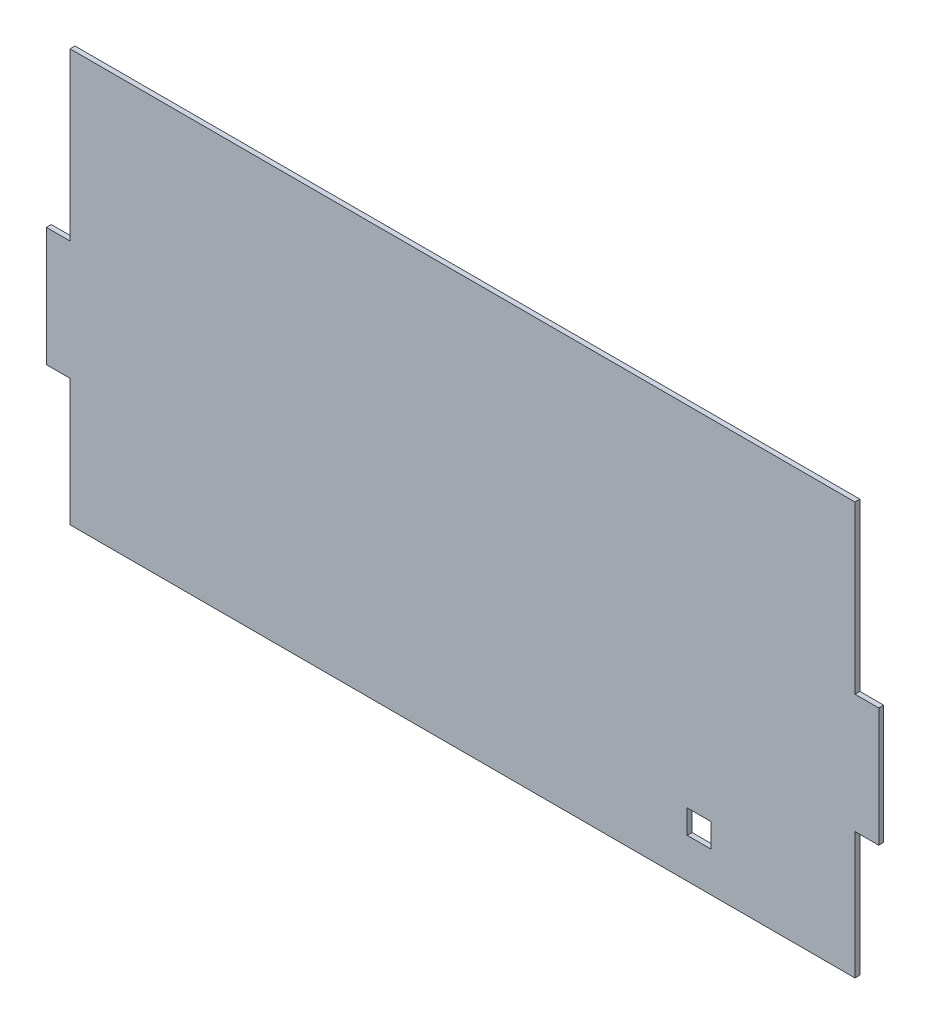
ISO-10303-21;
HEADER;
FILE_DESCRIPTION(('STEP AP214'),'2;1');
FILE_NAME('part.step','',(''),(''),'','','');
FILE_SCHEMA(('AUTOMOTIVE_DESIGN { 1 0 10303 214 1 1 1 1 }'));
ENDSEC;
DATA;
#1=APPLICATION_CONTEXT('core data for automotive mechanical design processes');
#2=APPLICATION_PROTOCOL_DEFINITION('international standard','automotive_design',2000,#1);
#3=PRODUCT_CONTEXT('',#1,'mechanical');
#4=PRODUCT('Part','Part','',(#3));
#5=PRODUCT_RELATED_PRODUCT_CATEGORY('part','',(#4));
#6=PRODUCT_DEFINITION_FORMATION('','',#4);
#7=PRODUCT_DEFINITION_CONTEXT('part definition',#1,'design');
#8=PRODUCT_DEFINITION('design','',#6,#7);
#9=PRODUCT_DEFINITION_SHAPE('','',#8);
#10=(LENGTH_UNIT() NAMED_UNIT(*) SI_UNIT(.MILLI.,.METRE.));
#11=(NAMED_UNIT(*) PLANE_ANGLE_UNIT() SI_UNIT($,.RADIAN.));
#12=(NAMED_UNIT(*) SI_UNIT($,.STERADIAN.) SOLID_ANGLE_UNIT());
#13=UNCERTAINTY_MEASURE_WITH_UNIT(LENGTH_MEASURE(1.E-05),#10,'distance_accuracy_value','');
#14=(GEOMETRIC_REPRESENTATION_CONTEXT(3) GLOBAL_UNCERTAINTY_ASSIGNED_CONTEXT((#13)) GLOBAL_UNIT_ASSIGNED_CONTEXT((#10,
#11,#12)) REPRESENTATION_CONTEXT('',''));
#15=CARTESIAN_POINT('',(0.,0.,0.));
#16=DIRECTION('',(0.,0.,1.));
#17=DIRECTION('',(1.,0.,0.));
#18=AXIS2_PLACEMENT_3D('',#15,#16,#17);
#19=CARTESIAN_POINT('',(0.,0.,3.));
#20=DIRECTION('',(0.,0.,-1.));
#21=DIRECTION('',(-1.,0.,0.));
#22=AXIS2_PLACEMENT_3D('',#19,#20,#21);
#23=PLANE('',#22);
#24=DIRECTION('',(0.,1.,0.));
#25=VECTOR('',#24,1.);
#26=CARTESIAN_POINT('',(987.723312498486,1081.39766001597,3.));
#27=LINE('',#26,#25);
#28=CARTESIAN_POINT('',(987.723312498486,1081.39766001597,3.));
#29=VERTEX_POINT('',#28);
#30=CARTESIAN_POINT('',(987.723312498486,1158.83589741721,3.));
#31=VERTEX_POINT('',#30);
#32=EDGE_CURVE('E182',#29,#31,#27,.T.);
#33=ORIENTED_EDGE('',*,*,#32,.T.);
#34=DIRECTION('',(1.,0.,0.));
#35=VECTOR('',#34,1.);
#36=CARTESIAN_POINT('',(987.723312498486,1158.83589741721,3.));
#37=LINE('',#36,#35);
#38=CARTESIAN_POINT('',(1002.2431904385,1158.83589741721,3.));
#39=VERTEX_POINT('',#38);
#40=EDGE_CURVE('E185',#31,#39,#37,.T.);
#41=ORIENTED_EDGE('',*,*,#40,.T.);
#42=DIRECTION('',(0.,1.,0.));
#43=VECTOR('',#42,1.);
#44=CARTESIAN_POINT('',(1002.2431904385,1158.83589741721,3.));
#45=LINE('',#44,#43);
#46=CARTESIAN_POINT('',(1002.2431904385,1231.43862195372,3.));
#47=VERTEX_POINT('',#46);
#48=EDGE_CURVE('E188',#39,#47,#45,.T.);
#49=ORIENTED_EDGE('',*,*,#48,.T.);
#50=DIRECTION('',(-1.,0.,0.));
#51=VECTOR('',#50,1.);
#52=CARTESIAN_POINT('',(1002.2431904385,1231.43862195372,3.));
#53=LINE('',#52,#51);
#54=CARTESIAN_POINT('',(987.723312498486,1231.43862195372,3.));
#55=VERTEX_POINT('',#54);
#56=EDGE_CURVE('E190',#47,#55,#53,.T.);
#57=ORIENTED_EDGE('',*,*,#56,.T.);
#58=DIRECTION('',(0.,1.,0.));
#59=VECTOR('',#58,1.);
#60=CARTESIAN_POINT('',(987.723312498486,1231.43862195372,3.));
#61=LINE('',#60,#59);
#62=CARTESIAN_POINT('',(987.723312498486,1333.07443269733,3.));
#63=VERTEX_POINT('',#62);
#64=EDGE_CURVE('E192',#55,#63,#61,.T.);
#65=ORIENTED_EDGE('',*,*,#64,.T.);
#66=DIRECTION('',(-1.,0.,0.));
#67=VECTOR('',#66,1.);
#68=CARTESIAN_POINT('',(987.723312498486,1333.07443269733,3.));
#69=LINE('',#68,#67);
#70=CARTESIAN_POINT('',(508.564005641683,1333.07443269733,3.));
#71=VERTEX_POINT('',#70);
#72=EDGE_CURVE('E194',#63,#71,#69,.T.);
#73=ORIENTED_EDGE('',*,*,#72,.T.);
#74=DIRECTION('',(0.,-1.,0.));
#75=VECTOR('',#74,1.);
#76=CARTESIAN_POINT('',(508.564005641683,1333.07443269733,3.));
#77=LINE('',#76,#75);
#78=CARTESIAN_POINT('',(508.564005641683,1231.43862195372,3.));
#79=VERTEX_POINT('',#78);
#80=EDGE_CURVE('E196',#71,#79,#77,.T.);
#81=ORIENTED_EDGE('',*,*,#80,.T.);
#82=DIRECTION('',(-1.,0.,0.));
#83=VECTOR('',#82,1.);
#84=CARTESIAN_POINT('',(508.564005641683,1231.43862195372,3.));
#85=LINE('',#84,#83);
#86=CARTESIAN_POINT('',(494.044127701673,1231.43862195372,3.));
#87=VERTEX_POINT('',#86);
#88=EDGE_CURVE('E198',#79,#87,#85,.T.);
#89=ORIENTED_EDGE('',*,*,#88,.T.);
#90=DIRECTION('',(0.,-1.,0.));
#91=VECTOR('',#90,1.);
#92=CARTESIAN_POINT('',(494.044127701673,1231.43862195372,3.));
#93=LINE('',#92,#91);
#94=CARTESIAN_POINT('',(494.044127701673,1158.83589741721,3.));
#95=VERTEX_POINT('',#94);
#96=EDGE_CURVE('E200',#87,#95,#93,.T.);
#97=ORIENTED_EDGE('',*,*,#96,.T.);
#98=DIRECTION('',(1.,0.,0.));
#99=VECTOR('',#98,1.);
#100=CARTESIAN_POINT('',(494.044127701673,1158.83589741721,3.));
#101=LINE('',#100,#99);
#102=CARTESIAN_POINT('',(508.564005641683,1158.83589741721,3.));
#103=VERTEX_POINT('',#102);
#104=EDGE_CURVE('E202',#95,#103,#101,.T.);
#105=ORIENTED_EDGE('',*,*,#104,.T.);
#106=DIRECTION('',(0.,-1.,0.));
#107=VECTOR('',#106,1.);
#108=CARTESIAN_POINT('',(508.564005641683,1158.83589741721,3.));
#109=LINE('',#108,#107);
#110=CARTESIAN_POINT('',(508.564005641683,1081.39766001597,3.));
#111=VERTEX_POINT('',#110);
#112=EDGE_CURVE('E204',#103,#111,#109,.T.);
#113=ORIENTED_EDGE('',*,*,#112,.T.);
#114=DIRECTION('',(1.,0.,0.));
#115=VECTOR('',#114,1.);
#116=CARTESIAN_POINT('',(508.564005641683,1081.39766001597,3.));
#117=LINE('',#116,#115);
#118=EDGE_CURVE('E206',#111,#29,#117,.T.);
#119=ORIENTED_EDGE('',*,*,#118,.T.);
#120=EDGE_LOOP('',(#33,#41,#49,#57,#65,#73,#81,#89,#97,#105,#113,#119));
#121=FACE_BOUND('',#120,.T.);
#122=DIRECTION('',(1.,0.,0.));
#123=VECTOR('',#122,1.);
#124=CARTESIAN_POINT('',(899.830362800067,1105.6035704495,3.));
#125=LINE('',#124,#123);
#126=CARTESIAN_POINT('',(885.310484860057,1105.6035704495,3.));
#127=VERTEX_POINT('',#126);
#128=CARTESIAN_POINT('',(899.830362800067,1105.6035704495,3.));
#129=VERTEX_POINT('',#128);
#130=EDGE_CURVE('E146',#127,#129,#125,.T.);
#131=ORIENTED_EDGE('',*,*,#130,.F.);
#132=DIRECTION('',(0.,-1.,0.));
#133=VECTOR('',#132,1.);
#134=CARTESIAN_POINT('',(885.310484860057,1105.6035704495,3.));
#135=LINE('',#134,#133);
#136=CARTESIAN_POINT('',(885.310484860057,1120.12344838951,3.));
#137=VERTEX_POINT('',#136);
#138=EDGE_CURVE('E168',#137,#127,#135,.T.);
#139=ORIENTED_EDGE('',*,*,#138,.F.);
#140=DIRECTION('',(-1.,0.,0.));
#141=VECTOR('',#140,1.);
#142=CARTESIAN_POINT('',(885.310484860057,1120.12344838951,3.));
#143=LINE('',#142,#141);
#144=CARTESIAN_POINT('',(899.830362800067,1120.12344838951,3.));
#145=VERTEX_POINT('',#144);
#146=EDGE_CURVE('E166',#145,#137,#143,.T.);
#147=ORIENTED_EDGE('',*,*,#146,.F.);
#148=DIRECTION('',(0.,1.,0.));
#149=VECTOR('',#148,1.);
#150=CARTESIAN_POINT('',(899.830362800067,1120.12344838951,3.));
#151=LINE('',#150,#149);
#152=EDGE_CURVE('E154',#129,#145,#151,.T.);
#153=ORIENTED_EDGE('',*,*,#152,.F.);
#154=EDGE_LOOP('',(#131,#139,#147,#153));
#155=FACE_BOUND('',#154,.T.);
#156=ADVANCED_FACE('F33',(#121,#155),#23,.F.);
#157=CARTESIAN_POINT('',(0.,0.,0.));
#158=DIRECTION('',(0.,0.,-1.));
#159=DIRECTION('',(-1.,0.,0.));
#160=AXIS2_PLACEMENT_3D('',#157,#158,#159);
#161=PLANE('',#160);
#162=DIRECTION('',(0.,1.,0.));
#163=VECTOR('',#162,1.);
#164=CARTESIAN_POINT('',(987.723312498486,1081.39766001597,0.));
#165=LINE('',#164,#163);
#166=CARTESIAN_POINT('',(987.723312498486,1081.39766001597,0.));
#167=VERTEX_POINT('',#166);
#168=CARTESIAN_POINT('',(987.723312498486,1158.83589741721,0.));
#169=VERTEX_POINT('',#168);
#170=EDGE_CURVE('E162',#167,#169,#165,.T.);
#171=ORIENTED_EDGE('',*,*,#170,.F.);
#172=DIRECTION('',(1.,0.,0.));
#173=VECTOR('',#172,1.);
#174=CARTESIAN_POINT('',(508.564005641683,1081.39766001597,0.));
#175=LINE('',#174,#173);
#176=CARTESIAN_POINT('',(508.564005641683,1081.39766001597,0.));
#177=VERTEX_POINT('',#176);
#178=EDGE_CURVE('E186',#177,#167,#175,.T.);
#179=ORIENTED_EDGE('',*,*,#178,.F.);
#180=DIRECTION('',(0.,-1.,0.));
#181=VECTOR('',#180,1.);
#182=CARTESIAN_POINT('',(508.564005641683,1158.83589741721,0.));
#183=LINE('',#182,#181);
#184=CARTESIAN_POINT('',(508.564005641683,1158.83589741721,0.));
#185=VERTEX_POINT('',#184);
#186=EDGE_CURVE('E229',#185,#177,#183,.T.);
#187=ORIENTED_EDGE('',*,*,#186,.F.);
#188=DIRECTION('',(1.,0.,0.));
#189=VECTOR('',#188,1.);
#190=CARTESIAN_POINT('',(494.044127701673,1158.83589741721,0.));
#191=LINE('',#190,#189);
#192=CARTESIAN_POINT('',(494.044127701673,1158.83589741721,0.));
#193=VERTEX_POINT('',#192);
#194=EDGE_CURVE('E227',#193,#185,#191,.T.);
#195=ORIENTED_EDGE('',*,*,#194,.F.);
#196=DIRECTION('',(0.,-1.,0.));
#197=VECTOR('',#196,1.);
#198=CARTESIAN_POINT('',(494.044127701673,1231.43862195372,0.));
#199=LINE('',#198,#197);
#200=CARTESIAN_POINT('',(494.044127701673,1231.43862195372,0.));
#201=VERTEX_POINT('',#200);
#202=EDGE_CURVE('E225',#201,#193,#199,.T.);
#203=ORIENTED_EDGE('',*,*,#202,.F.);
#204=DIRECTION('',(-1.,0.,0.));
#205=VECTOR('',#204,1.);
#206=CARTESIAN_POINT('',(508.564005641683,1231.43862195372,0.));
#207=LINE('',#206,#205);
#208=CARTESIAN_POINT('',(508.564005641683,1231.43862195372,0.));
#209=VERTEX_POINT('',#208);
#210=EDGE_CURVE('E223',#209,#201,#207,.T.);
#211=ORIENTED_EDGE('',*,*,#210,.F.);
#212=DIRECTION('',(0.,-1.,0.));
#213=VECTOR('',#212,1.);
#214=CARTESIAN_POINT('',(508.564005641683,1333.07443269733,0.));
#215=LINE('',#214,#213);
#216=CARTESIAN_POINT('',(508.564005641683,1333.07443269733,0.));
#217=VERTEX_POINT('',#216);
#218=EDGE_CURVE('E221',#217,#209,#215,.T.);
#219=ORIENTED_EDGE('',*,*,#218,.F.);
#220=DIRECTION('',(-1.,0.,0.));
#221=VECTOR('',#220,1.);
#222=CARTESIAN_POINT('',(987.723312498486,1333.07443269733,0.));
#223=LINE('',#222,#221);
#224=CARTESIAN_POINT('',(987.723312498486,1333.07443269733,0.));
#225=VERTEX_POINT('',#224);
#226=EDGE_CURVE('E219',#225,#217,#223,.T.);
#227=ORIENTED_EDGE('',*,*,#226,.F.);
#228=DIRECTION('',(0.,1.,0.));
#229=VECTOR('',#228,1.);
#230=CARTESIAN_POINT('',(987.723312498486,1231.43862195372,0.));
#231=LINE('',#230,#229);
#232=CARTESIAN_POINT('',(987.723312498486,1231.43862195372,0.));
#233=VERTEX_POINT('',#232);
#234=EDGE_CURVE('E217',#233,#225,#231,.T.);
#235=ORIENTED_EDGE('',*,*,#234,.F.);
#236=DIRECTION('',(-1.,0.,0.));
#237=VECTOR('',#236,1.);
#238=CARTESIAN_POINT('',(1002.2431904385,1231.43862195372,0.));
#239=LINE('',#238,#237);
#240=CARTESIAN_POINT('',(1002.2431904385,1231.43862195372,0.));
#241=VERTEX_POINT('',#240);
#242=EDGE_CURVE('E215',#241,#233,#239,.T.);
#243=ORIENTED_EDGE('',*,*,#242,.F.);
#244=DIRECTION('',(0.,1.,0.));
#245=VECTOR('',#244,1.);
#246=CARTESIAN_POINT('',(1002.2431904385,1158.83589741721,0.));
#247=LINE('',#246,#245);
#248=CARTESIAN_POINT('',(1002.2431904385,1158.83589741721,0.));
#249=VERTEX_POINT('',#248);
#250=EDGE_CURVE('E213',#249,#241,#247,.T.);
#251=ORIENTED_EDGE('',*,*,#250,.F.);
#252=DIRECTION('',(1.,0.,0.));
#253=VECTOR('',#252,1.);
#254=CARTESIAN_POINT('',(987.723312498486,1158.83589741721,0.));
#255=LINE('',#254,#253);
#256=EDGE_CURVE('E211',#169,#249,#255,.T.);
#257=ORIENTED_EDGE('',*,*,#256,.F.);
#258=EDGE_LOOP('',(#171,#179,#187,#195,#203,#211,#219,#227,#235,#243,#251,#257));
#259=FACE_BOUND('',#258,.T.);
#260=DIRECTION('',(0.,-1.,0.));
#261=VECTOR('',#260,1.);
#262=CARTESIAN_POINT('',(885.310484860057,1105.6035704495,0.));
#263=LINE('',#262,#261);
#264=CARTESIAN_POINT('',(885.310484860057,1120.12344838951,0.));
#265=VERTEX_POINT('',#264);
#266=CARTESIAN_POINT('',(885.310484860057,1105.6035704495,0.));
#267=VERTEX_POINT('',#266);
#268=EDGE_CURVE('E155',#265,#267,#263,.T.);
#269=ORIENTED_EDGE('',*,*,#268,.T.);
#270=DIRECTION('',(1.,0.,0.));
#271=VECTOR('',#270,1.);
#272=CARTESIAN_POINT('',(899.830362800067,1105.6035704495,0.));
#273=LINE('',#272,#271);
#274=CARTESIAN_POINT('',(899.830362800067,1105.6035704495,0.));
#275=VERTEX_POINT('',#274);
#276=EDGE_CURVE('E56',#267,#275,#273,.T.);
#277=ORIENTED_EDGE('',*,*,#276,.T.);
#278=DIRECTION('',(0.,1.,0.));
#279=VECTOR('',#278,1.);
#280=CARTESIAN_POINT('',(899.830362800067,1120.12344838951,0.));
#281=LINE('',#280,#279);
#282=CARTESIAN_POINT('',(899.830362800067,1120.12344838951,0.));
#283=VERTEX_POINT('',#282);
#284=EDGE_CURVE('E161',#275,#283,#281,.T.);
#285=ORIENTED_EDGE('',*,*,#284,.T.);
#286=DIRECTION('',(-1.,0.,0.));
#287=VECTOR('',#286,1.);
#288=CARTESIAN_POINT('',(885.310484860057,1120.12344838951,0.));
#289=LINE('',#288,#287);
#290=EDGE_CURVE('E174',#283,#265,#289,.T.);
#291=ORIENTED_EDGE('',*,*,#290,.T.);
#292=EDGE_LOOP('',(#269,#277,#285,#291));
#293=FACE_BOUND('',#292,.T.);
#294=ADVANCED_FACE('F271',(#259,#293),#161,.T.);
#295=CARTESIAN_POINT('',(987.723312498486,1081.39766001597,3.));
#296=DIRECTION('',(-1.,0.,0.));
#297=DIRECTION('',(0.,0.,1.));
#298=AXIS2_PLACEMENT_3D('',#295,#296,#297);
#299=PLANE('',#298);
#300=ORIENTED_EDGE('',*,*,#170,.T.);
#301=DIRECTION('',(0.,0.,-1.));
#302=VECTOR('',#301,1.);
#303=CARTESIAN_POINT('',(987.723312498486,1158.83589741721,3.));
#304=LINE('',#303,#302);
#305=EDGE_CURVE('E11',#31,#169,#304,.T.);
#306=ORIENTED_EDGE('',*,*,#305,.F.);
#307=ORIENTED_EDGE('',*,*,#32,.F.);
#308=DIRECTION('',(0.,0.,-1.));
#309=VECTOR('',#308,1.);
#310=CARTESIAN_POINT('',(987.723312498486,1081.39766001597,3.));
#311=LINE('',#310,#309);
#312=EDGE_CURVE('E208',#29,#167,#311,.T.);
#313=ORIENTED_EDGE('',*,*,#312,.T.);
#314=EDGE_LOOP('',(#300,#306,#307,#313));
#315=FACE_BOUND('',#314,.T.);
#316=ADVANCED_FACE('F35',(#315),#299,.F.);
#317=CARTESIAN_POINT('',(987.723312498486,1158.83589741721,3.));
#318=DIRECTION('',(0.,1.,0.));
#319=DIRECTION('',(0.,0.,1.));
#320=AXIS2_PLACEMENT_3D('',#317,#318,#319);
#321=PLANE('',#320);
#322=ORIENTED_EDGE('',*,*,#256,.T.);
#323=DIRECTION('',(0.,0.,-1.));
#324=VECTOR('',#323,1.);
#325=CARTESIAN_POINT('',(1002.2431904385,1158.83589741721,3.));
#326=LINE('',#325,#324);
#327=EDGE_CURVE('E41',#39,#249,#326,.T.);
#328=ORIENTED_EDGE('',*,*,#327,.F.);
#329=ORIENTED_EDGE('',*,*,#40,.F.);
#330=ORIENTED_EDGE('',*,*,#305,.T.);
#331=EDGE_LOOP('',(#322,#328,#329,#330));
#332=FACE_BOUND('',#331,.T.);
#333=ADVANCED_FACE('F288',(#332),#321,.F.);
#334=CARTESIAN_POINT('',(1002.2431904385,1158.83589741721,3.));
#335=DIRECTION('',(-1.,0.,0.));
#336=DIRECTION('',(0.,0.,1.));
#337=AXIS2_PLACEMENT_3D('',#334,#335,#336);
#338=PLANE('',#337);
#339=ORIENTED_EDGE('',*,*,#250,.T.);
#340=DIRECTION('',(0.,0.,-1.));
#341=VECTOR('',#340,1.);
#342=CARTESIAN_POINT('',(1002.2431904385,1231.43862195372,3.));
#343=LINE('',#342,#341);
#344=EDGE_CURVE('E258',#47,#241,#343,.T.);
#345=ORIENTED_EDGE('',*,*,#344,.F.);
#346=ORIENTED_EDGE('',*,*,#48,.F.);
#347=ORIENTED_EDGE('',*,*,#327,.T.);
#348=EDGE_LOOP('',(#339,#345,#346,#347));
#349=FACE_BOUND('',#348,.T.);
#350=ADVANCED_FACE('F265',(#349),#338,.F.);
#351=CARTESIAN_POINT('',(1002.2431904385,1231.43862195372,3.));
#352=DIRECTION('',(0.,-1.,0.));
#353=DIRECTION('',(0.,0.,-1.));
#354=AXIS2_PLACEMENT_3D('',#351,#352,#353);
#355=PLANE('',#354);
#356=ORIENTED_EDGE('',*,*,#242,.T.);
#357=DIRECTION('',(0.,0.,-1.));
#358=VECTOR('',#357,1.);
#359=CARTESIAN_POINT('',(987.723312498486,1231.43862195372,3.));
#360=LINE('',#359,#358);
#361=EDGE_CURVE('E255',#55,#233,#360,.T.);
#362=ORIENTED_EDGE('',*,*,#361,.F.);
#363=ORIENTED_EDGE('',*,*,#56,.F.);
#364=ORIENTED_EDGE('',*,*,#344,.T.);
#365=EDGE_LOOP('',(#356,#362,#363,#364));
#366=FACE_BOUND('',#365,.T.);
#367=ADVANCED_FACE('F277',(#366),#355,.F.);
#368=CARTESIAN_POINT('',(987.723312498486,1231.43862195372,3.));
#369=DIRECTION('',(-1.,0.,0.));
#370=DIRECTION('',(0.,0.,1.));
#371=AXIS2_PLACEMENT_3D('',#368,#369,#370);
#372=PLANE('',#371);
#373=ORIENTED_EDGE('',*,*,#234,.T.);
#374=DIRECTION('',(0.,0.,-1.));
#375=VECTOR('',#374,1.);
#376=CARTESIAN_POINT('',(987.723312498486,1333.07443269733,3.));
#377=LINE('',#376,#375);
#378=EDGE_CURVE('E252',#63,#225,#377,.T.);
#379=ORIENTED_EDGE('',*,*,#378,.F.);
#380=ORIENTED_EDGE('',*,*,#64,.F.);
#381=ORIENTED_EDGE('',*,*,#361,.T.);
#382=EDGE_LOOP('',(#373,#379,#380,#381));
#383=FACE_BOUND('',#382,.T.);
#384=ADVANCED_FACE('F281',(#383),#372,.F.);
#385=CARTESIAN_POINT('',(987.723312498486,1333.07443269733,3.));
#386=DIRECTION('',(0.,-1.,0.));
#387=DIRECTION('',(0.,0.,-1.));
#388=AXIS2_PLACEMENT_3D('',#385,#386,#387);
#389=PLANE('',#388);
#390=ORIENTED_EDGE('',*,*,#226,.T.);
#391=DIRECTION('',(0.,0.,-1.));
#392=VECTOR('',#391,1.);
#393=CARTESIAN_POINT('',(508.564005641683,1333.07443269733,3.));
#394=LINE('',#393,#392);
#395=EDGE_CURVE('E249',#71,#217,#394,.T.);
#396=ORIENTED_EDGE('',*,*,#395,.F.);
#397=ORIENTED_EDGE('',*,*,#72,.F.);
#398=ORIENTED_EDGE('',*,*,#378,.T.);
#399=EDGE_LOOP('',(#390,#396,#397,#398));
#400=FACE_BOUND('',#399,.T.);
#401=ADVANCED_FACE('F321',(#400),#389,.F.);
#402=CARTESIAN_POINT('',(508.564005641683,1333.07443269733,3.));
#403=DIRECTION('',(1.,0.,0.));
#404=DIRECTION('',(0.,0.,-1.));
#405=AXIS2_PLACEMENT_3D('',#402,#403,#404);
#406=PLANE('',#405);
#407=ORIENTED_EDGE('',*,*,#218,.T.);
#408=DIRECTION('',(0.,0.,-1.));
#409=VECTOR('',#408,1.);
#410=CARTESIAN_POINT('',(508.564005641683,1231.43862195372,3.));
#411=LINE('',#410,#409);
#412=EDGE_CURVE('E246',#79,#209,#411,.T.);
#413=ORIENTED_EDGE('',*,*,#412,.F.);
#414=ORIENTED_EDGE('',*,*,#80,.F.);
#415=ORIENTED_EDGE('',*,*,#395,.T.);
#416=EDGE_LOOP('',(#407,#413,#414,#415));
#417=FACE_BOUND('',#416,.T.);
#418=ADVANCED_FACE('F319',(#417),#406,.F.);
#419=CARTESIAN_POINT('',(508.564005641683,1231.43862195372,3.));
#420=DIRECTION('',(0.,-1.,0.));
#421=DIRECTION('',(0.,0.,-1.));
#422=AXIS2_PLACEMENT_3D('',#419,#420,#421);
#423=PLANE('',#422);
#424=ORIENTED_EDGE('',*,*,#210,.T.);
#425=DIRECTION('',(0.,0.,-1.));
#426=VECTOR('',#425,1.);
#427=CARTESIAN_POINT('',(494.044127701673,1231.43862195372,3.));
#428=LINE('',#427,#426);
#429=EDGE_CURVE('E243',#87,#201,#428,.T.);
#430=ORIENTED_EDGE('',*,*,#429,.F.);
#431=ORIENTED_EDGE('',*,*,#88,.F.);
#432=ORIENTED_EDGE('',*,*,#412,.T.);
#433=EDGE_LOOP('',(#424,#430,#431,#432));
#434=FACE_BOUND('',#433,.T.);
#435=ADVANCED_FACE('F315',(#434),#423,.F.);
#436=CARTESIAN_POINT('',(494.044127701673,1231.43862195372,3.));
#437=DIRECTION('',(1.,0.,0.));
#438=DIRECTION('',(0.,0.,-1.));
#439=AXIS2_PLACEMENT_3D('',#436,#437,#438);
#440=PLANE('',#439);
#441=ORIENTED_EDGE('',*,*,#202,.T.);
#442=DIRECTION('',(0.,0.,-1.));
#443=VECTOR('',#442,1.);
#444=CARTESIAN_POINT('',(494.044127701673,1158.83589741721,3.));
#445=LINE('',#444,#443);
#446=EDGE_CURVE('E240',#95,#193,#445,.T.);
#447=ORIENTED_EDGE('',*,*,#446,.F.);
#448=ORIENTED_EDGE('',*,*,#96,.F.);
#449=ORIENTED_EDGE('',*,*,#429,.T.);
#450=EDGE_LOOP('',(#441,#447,#448,#449));
#451=FACE_BOUND('',#450,.T.);
#452=ADVANCED_FACE('F310',(#451),#440,.F.);
#453=CARTESIAN_POINT('',(494.044127701673,1158.83589741721,3.));
#454=DIRECTION('',(0.,1.,0.));
#455=DIRECTION('',(0.,0.,1.));
#456=AXIS2_PLACEMENT_3D('',#453,#454,#455);
#457=PLANE('',#456);
#458=ORIENTED_EDGE('',*,*,#194,.T.);
#459=DIRECTION('',(0.,0.,-1.));
#460=VECTOR('',#459,1.);
#461=CARTESIAN_POINT('',(508.564005641683,1158.83589741721,3.));
#462=LINE('',#461,#460);
#463=EDGE_CURVE('E237',#103,#185,#462,.T.);
#464=ORIENTED_EDGE('',*,*,#463,.F.);
#465=ORIENTED_EDGE('',*,*,#104,.F.);
#466=ORIENTED_EDGE('',*,*,#446,.T.);
#467=EDGE_LOOP('',(#458,#464,#465,#466));
#468=FACE_BOUND('',#467,.T.);
#469=ADVANCED_FACE('F304',(#468),#457,.F.);
#470=CARTESIAN_POINT('',(508.564005641683,1158.83589741721,3.));
#471=DIRECTION('',(1.,0.,0.));
#472=DIRECTION('',(0.,0.,-1.));
#473=AXIS2_PLACEMENT_3D('',#470,#471,#472);
#474=PLANE('',#473);
#475=ORIENTED_EDGE('',*,*,#186,.T.);
#476=DIRECTION('',(0.,0.,-1.));
#477=VECTOR('',#476,1.);
#478=CARTESIAN_POINT('',(508.564005641683,1081.39766001597,3.));
#479=LINE('',#478,#477);
#480=EDGE_CURVE('E234',#111,#177,#479,.T.);
#481=ORIENTED_EDGE('',*,*,#480,.F.);
#482=ORIENTED_EDGE('',*,*,#112,.F.);
#483=ORIENTED_EDGE('',*,*,#463,.T.);
#484=EDGE_LOOP('',(#475,#481,#482,#483));
#485=FACE_BOUND('',#484,.T.);
#486=ADVANCED_FACE('F300',(#485),#474,.F.);
#487=CARTESIAN_POINT('',(508.564005641683,1081.39766001597,3.));
#488=DIRECTION('',(0.,1.,0.));
#489=DIRECTION('',(0.,0.,1.));
#490=AXIS2_PLACEMENT_3D('',#487,#488,#489);
#491=PLANE('',#490);
#492=ORIENTED_EDGE('',*,*,#178,.T.);
#493=ORIENTED_EDGE('',*,*,#312,.F.);
#494=ORIENTED_EDGE('',*,*,#118,.F.);
#495=ORIENTED_EDGE('',*,*,#480,.T.);
#496=EDGE_LOOP('',(#492,#493,#494,#495));
#497=FACE_BOUND('',#496,.T.);
#498=ADVANCED_FACE('F295',(#497),#491,.F.);
#499=CARTESIAN_POINT('',(899.830362800067,1105.6035704495,3.));
#500=DIRECTION('',(0.,1.,0.));
#501=DIRECTION('',(0.,0.,1.));
#502=AXIS2_PLACEMENT_3D('',#499,#500,#501);
#503=PLANE('',#502);
#504=ORIENTED_EDGE('',*,*,#276,.F.);
#505=DIRECTION('',(0.,0.,-1.));
#506=VECTOR('',#505,1.);
#507=CARTESIAN_POINT('',(885.310484860057,1105.6035704495,3.));
#508=LINE('',#507,#506);
#509=EDGE_CURVE('E150',#127,#267,#508,.T.);
#510=ORIENTED_EDGE('',*,*,#509,.F.);
#511=ORIENTED_EDGE('',*,*,#130,.T.);
#512=DIRECTION('',(0.,0.,-1.));
#513=VECTOR('',#512,1.);
#514=CARTESIAN_POINT('',(899.830362800067,1105.6035704495,3.));
#515=LINE('',#514,#513);
#516=EDGE_CURVE('E149',#129,#275,#515,.T.);
#517=ORIENTED_EDGE('',*,*,#516,.T.);
#518=EDGE_LOOP('',(#504,#510,#511,#517));
#519=FACE_BOUND('',#518,.T.);
#520=ADVANCED_FACE('F148',(#519),#503,.T.);
#521=CARTESIAN_POINT('',(899.830362800067,1120.12344838951,3.));
#522=DIRECTION('',(-1.,0.,0.));
#523=DIRECTION('',(0.,0.,1.));
#524=AXIS2_PLACEMENT_3D('',#521,#522,#523);
#525=PLANE('',#524);
#526=ORIENTED_EDGE('',*,*,#284,.F.);
#527=ORIENTED_EDGE('',*,*,#516,.F.);
#528=ORIENTED_EDGE('',*,*,#152,.T.);
#529=DIRECTION('',(0.,0.,-1.));
#530=VECTOR('',#529,1.);
#531=CARTESIAN_POINT('',(899.830362800067,1120.12344838951,3.));
#532=LINE('',#531,#530);
#533=EDGE_CURVE('E163',#145,#283,#532,.T.);
#534=ORIENTED_EDGE('',*,*,#533,.T.);
#535=EDGE_LOOP('',(#526,#527,#528,#534));
#536=FACE_BOUND('',#535,.T.);
#537=ADVANCED_FACE('F158',(#536),#525,.T.);
#538=CARTESIAN_POINT('',(885.310484860057,1120.12344838951,3.));
#539=DIRECTION('',(0.,-1.,0.));
#540=DIRECTION('',(0.,0.,-1.));
#541=AXIS2_PLACEMENT_3D('',#538,#539,#540);
#542=PLANE('',#541);
#543=ORIENTED_EDGE('',*,*,#290,.F.);
#544=ORIENTED_EDGE('',*,*,#533,.F.);
#545=ORIENTED_EDGE('',*,*,#146,.T.);
#546=DIRECTION('',(0.,0.,-1.));
#547=VECTOR('',#546,1.);
#548=CARTESIAN_POINT('',(885.310484860057,1120.12344838951,3.));
#549=LINE('',#548,#547);
#550=EDGE_CURVE('E48',#137,#265,#549,.T.);
#551=ORIENTED_EDGE('',*,*,#550,.T.);
#552=EDGE_LOOP('',(#543,#544,#545,#551));
#553=FACE_BOUND('',#552,.T.);
#554=ADVANCED_FACE('F379',(#553),#542,.T.);
#555=CARTESIAN_POINT('',(885.310484860057,1105.6035704495,3.));
#556=DIRECTION('',(1.,0.,0.));
#557=DIRECTION('',(0.,0.,-1.));
#558=AXIS2_PLACEMENT_3D('',#555,#556,#557);
#559=PLANE('',#558);
#560=ORIENTED_EDGE('',*,*,#268,.F.);
#561=ORIENTED_EDGE('',*,*,#550,.F.);
#562=ORIENTED_EDGE('',*,*,#138,.T.);
#563=ORIENTED_EDGE('',*,*,#509,.T.);
#564=EDGE_LOOP('',(#560,#561,#562,#563));
#565=FACE_BOUND('',#564,.T.);
#566=ADVANCED_FACE('F385',(#565),#559,.T.);
#567=CLOSED_SHELL('',(#156,#294,#316,#333,#350,#367,#384,#401,#418,#435,#452,#469,#486,#498,
#520,#537,#554,#566));
#568=MANIFOLD_SOLID_BREP('B2',#567);
#569=ADVANCED_BREP_SHAPE_REPRESENTATION('',(#18,#568),#14);
#570=SHAPE_DEFINITION_REPRESENTATION(#9,#569);
ENDSEC;
END-ISO-10303-21;
